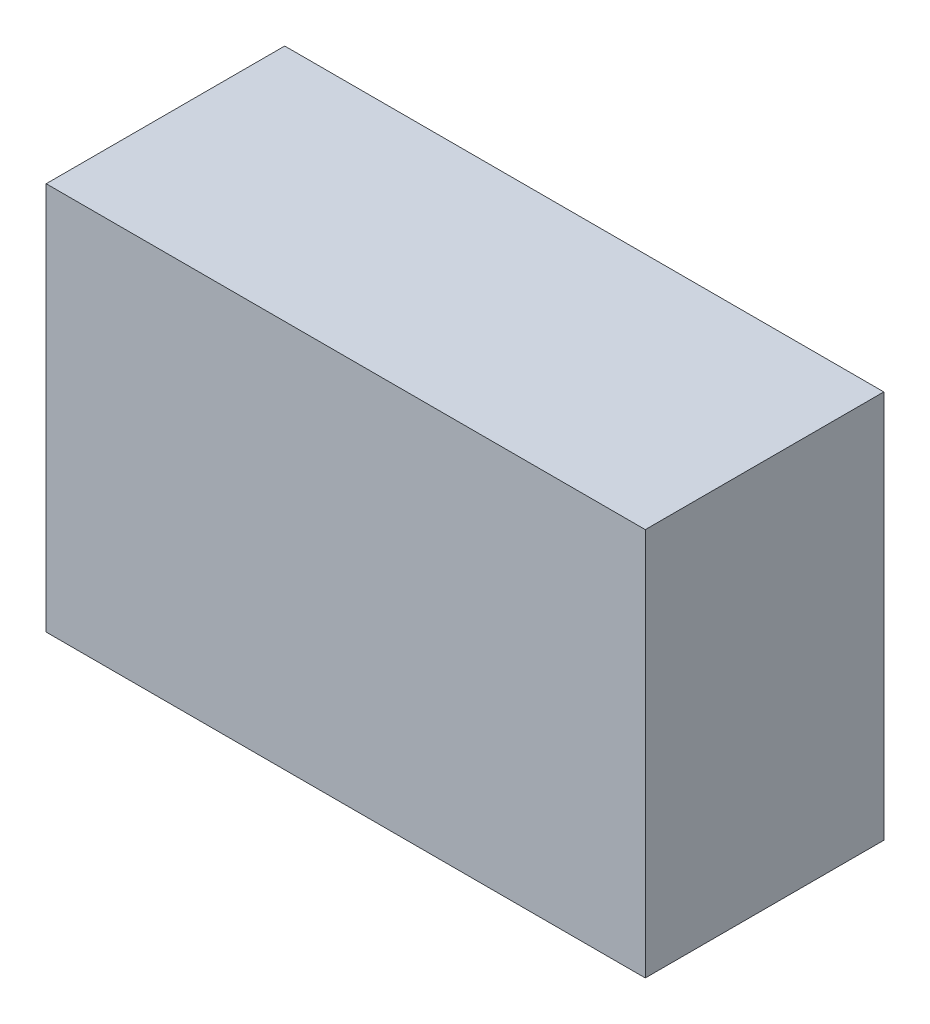
ISO-10303-21;
HEADER;
FILE_DESCRIPTION(('STEP AP214'),'2;1');
FILE_NAME('part.step','',(''),(''),'','','');
FILE_SCHEMA(('AUTOMOTIVE_DESIGN { 1 0 10303 214 1 1 1 1 }'));
ENDSEC;
DATA;
#1=APPLICATION_CONTEXT('core data for automotive mechanical design processes');
#2=APPLICATION_PROTOCOL_DEFINITION('international standard','automotive_design',2000,#1);
#3=PRODUCT_CONTEXT('',#1,'mechanical');
#4=PRODUCT('Part','Part','',(#3));
#5=PRODUCT_RELATED_PRODUCT_CATEGORY('part','',(#4));
#6=PRODUCT_DEFINITION_FORMATION('','',#4);
#7=PRODUCT_DEFINITION_CONTEXT('part definition',#1,'design');
#8=PRODUCT_DEFINITION('design','',#6,#7);
#9=PRODUCT_DEFINITION_SHAPE('','',#8);
#10=(LENGTH_UNIT() NAMED_UNIT(*) SI_UNIT(.MILLI.,.METRE.));
#11=(NAMED_UNIT(*) PLANE_ANGLE_UNIT() SI_UNIT($,.RADIAN.));
#12=(NAMED_UNIT(*) SI_UNIT($,.STERADIAN.) SOLID_ANGLE_UNIT());
#13=UNCERTAINTY_MEASURE_WITH_UNIT(LENGTH_MEASURE(1.E-05),#10,'distance_accuracy_value','');
#14=(GEOMETRIC_REPRESENTATION_CONTEXT(3) GLOBAL_UNCERTAINTY_ASSIGNED_CONTEXT((#13)) GLOBAL_UNIT_ASSIGNED_CONTEXT((#10,
#11,#12)) REPRESENTATION_CONTEXT('',''));
#15=CARTESIAN_POINT('',(0.,0.,0.));
#16=DIRECTION('',(0.,0.,1.));
#17=DIRECTION('',(1.,0.,0.));
#18=AXIS2_PLACEMENT_3D('',#15,#16,#17);
#19=CARTESIAN_POINT('',(27.,-17.5,21.5));
#20=DIRECTION('',(-1.,0.,0.));
#21=DIRECTION('',(0.,0.,1.));
#22=AXIS2_PLACEMENT_3D('',#19,#20,#21);
#23=PLANE('',#22);
#24=DIRECTION('',(0.,1.,0.));
#25=VECTOR('',#24,1.);
#26=CARTESIAN_POINT('',(27.,-17.5,0.));
#27=LINE('',#26,#25);
#28=CARTESIAN_POINT('',(27.,-17.5,0.));
#29=VERTEX_POINT('',#28);
#30=CARTESIAN_POINT('',(27.,17.5,0.));
#31=VERTEX_POINT('',#30);
#32=EDGE_CURVE('E96',#29,#31,#27,.T.);
#33=ORIENTED_EDGE('',*,*,#32,.T.);
#34=DIRECTION('',(0.,0.,-1.));
#35=VECTOR('',#34,1.);
#36=CARTESIAN_POINT('',(27.,17.5,21.5));
#37=LINE('',#36,#35);
#38=CARTESIAN_POINT('',(27.,17.5,21.5));
#39=VERTEX_POINT('',#38);
#40=EDGE_CURVE('E11',#39,#31,#37,.T.);
#41=ORIENTED_EDGE('',*,*,#40,.F.);
#42=DIRECTION('',(0.,1.,0.));
#43=VECTOR('',#42,1.);
#44=CARTESIAN_POINT('',(27.,-17.5,21.5));
#45=LINE('',#44,#43);
#46=CARTESIAN_POINT('',(27.,-17.5,21.5));
#47=VERTEX_POINT('',#46);
#48=EDGE_CURVE('E84',#47,#39,#45,.T.);
#49=ORIENTED_EDGE('',*,*,#48,.F.);
#50=DIRECTION('',(0.,0.,-1.));
#51=VECTOR('',#50,1.);
#52=CARTESIAN_POINT('',(27.,-17.5,21.5));
#53=LINE('',#52,#51);
#54=EDGE_CURVE('E92',#47,#29,#53,.T.);
#55=ORIENTED_EDGE('',*,*,#54,.T.);
#56=EDGE_LOOP('',(#33,#41,#49,#55));
#57=FACE_BOUND('',#56,.T.);
#58=ADVANCED_FACE('F33',(#57),#23,.F.);
#59=CARTESIAN_POINT('',(-27.,17.5,21.5));
#60=DIRECTION('',(0.,-1.,0.));
#61=DIRECTION('',(0.,0.,-1.));
#62=AXIS2_PLACEMENT_3D('',#59,#60,#61);
#63=PLANE('',#62);
#64=DIRECTION('',(-1.,0.,0.));
#65=VECTOR('',#64,1.);
#66=CARTESIAN_POINT('',(-27.,17.5,0.));
#67=LINE('',#66,#65);
#68=CARTESIAN_POINT('',(-27.,17.5,0.));
#69=VERTEX_POINT('',#68);
#70=EDGE_CURVE('E88',#31,#69,#67,.T.);
#71=ORIENTED_EDGE('',*,*,#70,.T.);
#72=DIRECTION('',(0.,0.,-1.));
#73=VECTOR('',#72,1.);
#74=CARTESIAN_POINT('',(-27.,17.5,21.5));
#75=LINE('',#74,#73);
#76=CARTESIAN_POINT('',(-27.,17.5,21.5));
#77=VERTEX_POINT('',#76);
#78=EDGE_CURVE('E41',#77,#69,#75,.T.);
#79=ORIENTED_EDGE('',*,*,#78,.F.);
#80=DIRECTION('',(-1.,0.,0.));
#81=VECTOR('',#80,1.);
#82=CARTESIAN_POINT('',(-27.,17.5,21.5));
#83=LINE('',#82,#81);
#84=EDGE_CURVE('E79',#39,#77,#83,.T.);
#85=ORIENTED_EDGE('',*,*,#84,.F.);
#86=ORIENTED_EDGE('',*,*,#40,.T.);
#87=EDGE_LOOP('',(#71,#79,#85,#86));
#88=FACE_BOUND('',#87,.T.);
#89=ADVANCED_FACE('F87',(#88),#63,.F.);
#90=CARTESIAN_POINT('',(-27.,-17.5,21.5));
#91=DIRECTION('',(1.,0.,0.));
#92=DIRECTION('',(0.,0.,-1.));
#93=AXIS2_PLACEMENT_3D('',#90,#91,#92);
#94=PLANE('',#93);
#95=DIRECTION('',(0.,-1.,0.));
#96=VECTOR('',#95,1.);
#97=CARTESIAN_POINT('',(-27.,-17.5,0.));
#98=LINE('',#97,#96);
#99=CARTESIAN_POINT('',(-27.,-17.5,0.));
#100=VERTEX_POINT('',#99);
#101=EDGE_CURVE('E66',#69,#100,#98,.T.);
#102=ORIENTED_EDGE('',*,*,#101,.T.);
#103=DIRECTION('',(0.,0.,-1.));
#104=VECTOR('',#103,1.);
#105=CARTESIAN_POINT('',(-27.,-17.5,21.5));
#106=LINE('',#105,#104);
#107=CARTESIAN_POINT('',(-27.,-17.5,21.5));
#108=VERTEX_POINT('',#107);
#109=EDGE_CURVE('E89',#108,#100,#106,.T.);
#110=ORIENTED_EDGE('',*,*,#109,.F.);
#111=DIRECTION('',(0.,-1.,0.));
#112=VECTOR('',#111,1.);
#113=CARTESIAN_POINT('',(-27.,-17.5,21.5));
#114=LINE('',#113,#112);
#115=EDGE_CURVE('E82',#77,#108,#114,.T.);
#116=ORIENTED_EDGE('',*,*,#115,.F.);
#117=ORIENTED_EDGE('',*,*,#78,.T.);
#118=EDGE_LOOP('',(#102,#110,#116,#117));
#119=FACE_BOUND('',#118,.T.);
#120=ADVANCED_FACE('F90',(#119),#94,.F.);
#121=CARTESIAN_POINT('',(-27.,-17.5,21.5));
#122=DIRECTION('',(0.,1.,0.));
#123=DIRECTION('',(0.,0.,1.));
#124=AXIS2_PLACEMENT_3D('',#121,#122,#123);
#125=PLANE('',#124);
#126=DIRECTION('',(1.,0.,0.));
#127=VECTOR('',#126,1.);
#128=CARTESIAN_POINT('',(-27.,-17.5,0.));
#129=LINE('',#128,#127);
#130=EDGE_CURVE('E72',#100,#29,#129,.T.);
#131=ORIENTED_EDGE('',*,*,#130,.T.);
#132=ORIENTED_EDGE('',*,*,#54,.F.);
#133=DIRECTION('',(1.,0.,0.));
#134=VECTOR('',#133,1.);
#135=CARTESIAN_POINT('',(-27.,-17.5,21.5));
#136=LINE('',#135,#134);
#137=EDGE_CURVE('E49',#108,#47,#136,.T.);
#138=ORIENTED_EDGE('',*,*,#137,.F.);
#139=ORIENTED_EDGE('',*,*,#109,.T.);
#140=EDGE_LOOP('',(#131,#132,#138,#139));
#141=FACE_BOUND('',#140,.T.);
#142=ADVANCED_FACE('F103',(#141),#125,.F.);
#143=CARTESIAN_POINT('',(0.,0.,21.5));
#144=DIRECTION('',(0.,0.,-1.));
#145=DIRECTION('',(-1.,0.,0.));
#146=AXIS2_PLACEMENT_3D('',#143,#144,#145);
#147=PLANE('',#146);
#148=ORIENTED_EDGE('',*,*,#48,.T.);
#149=ORIENTED_EDGE('',*,*,#84,.T.);
#150=ORIENTED_EDGE('',*,*,#115,.T.);
#151=ORIENTED_EDGE('',*,*,#137,.T.);
#152=EDGE_LOOP('',(#148,#149,#150,#151));
#153=FACE_BOUND('',#152,.T.);
#154=ADVANCED_FACE('F80',(#153),#147,.F.);
#155=CARTESIAN_POINT('',(0.,0.,0.));
#156=DIRECTION('',(0.,0.,-1.));
#157=DIRECTION('',(-1.,0.,0.));
#158=AXIS2_PLACEMENT_3D('',#155,#156,#157);
#159=PLANE('',#158);
#160=ORIENTED_EDGE('',*,*,#32,.F.);
#161=ORIENTED_EDGE('',*,*,#130,.F.);
#162=ORIENTED_EDGE('',*,*,#101,.F.);
#163=ORIENTED_EDGE('',*,*,#70,.F.);
#164=EDGE_LOOP('',(#160,#161,#162,#163));
#165=FACE_BOUND('',#164,.T.);
#166=ADVANCED_FACE('F106',(#165),#159,.T.);
#167=CLOSED_SHELL('',(#58,#89,#120,#142,#154,#166));
#168=MANIFOLD_SOLID_BREP('B2',#167);
#169=ADVANCED_BREP_SHAPE_REPRESENTATION('',(#18,#168),#14);
#170=SHAPE_DEFINITION_REPRESENTATION(#9,#169);
ENDSEC;
END-ISO-10303-21;
